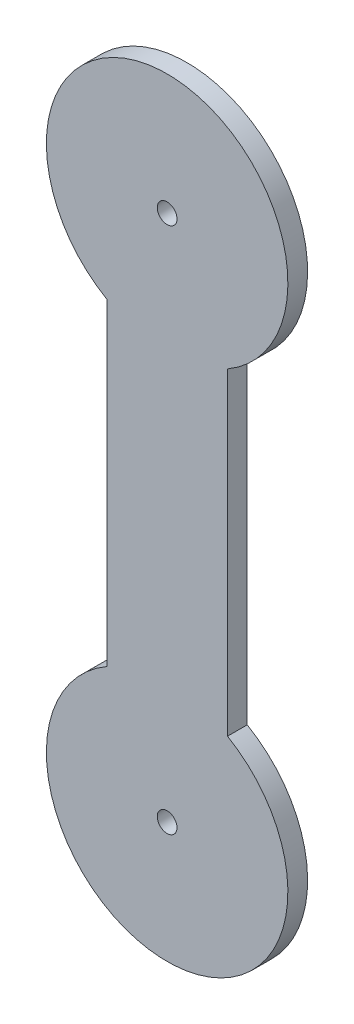
ISO-10303-21;
HEADER;
FILE_DESCRIPTION(('STEP AP214'),'2;1');
FILE_NAME('part.step','',(''),(''),'','','');
FILE_SCHEMA(('AUTOMOTIVE_DESIGN { 1 0 10303 214 1 1 1 1 }'));
ENDSEC;
DATA;
#1=APPLICATION_CONTEXT('core data for automotive mechanical design processes');
#2=APPLICATION_PROTOCOL_DEFINITION('international standard','automotive_design',2000,#1);
#3=PRODUCT_CONTEXT('',#1,'mechanical');
#4=PRODUCT('Part','Part','',(#3));
#5=PRODUCT_RELATED_PRODUCT_CATEGORY('part','',(#4));
#6=PRODUCT_DEFINITION_FORMATION('','',#4);
#7=PRODUCT_DEFINITION_CONTEXT('part definition',#1,'design');
#8=PRODUCT_DEFINITION('design','',#6,#7);
#9=PRODUCT_DEFINITION_SHAPE('','',#8);
#10=(LENGTH_UNIT() NAMED_UNIT(*) SI_UNIT(.MILLI.,.METRE.));
#11=(NAMED_UNIT(*) PLANE_ANGLE_UNIT() SI_UNIT($,.RADIAN.));
#12=(NAMED_UNIT(*) SI_UNIT($,.STERADIAN.) SOLID_ANGLE_UNIT());
#13=UNCERTAINTY_MEASURE_WITH_UNIT(LENGTH_MEASURE(1.E-05),#10,'distance_accuracy_value','');
#14=(GEOMETRIC_REPRESENTATION_CONTEXT(3) GLOBAL_UNCERTAINTY_ASSIGNED_CONTEXT((#13)) GLOBAL_UNIT_ASSIGNED_CONTEXT((#10,
#11,#12)) REPRESENTATION_CONTEXT('',''));
#15=CARTESIAN_POINT('',(0.,0.,0.));
#16=DIRECTION('',(0.,0.,1.));
#17=DIRECTION('',(1.,0.,0.));
#18=AXIS2_PLACEMENT_3D('',#15,#16,#17);
#19=CARTESIAN_POINT('',(19.05,0.,6.223));
#20=DIRECTION('',(0.,0.,-1.));
#21=DIRECTION('',(-1.,0.,0.));
#22=AXIS2_PLACEMENT_3D('',#19,#20,#21);
#23=CYLINDRICAL_SURFACE('',#22,38.1);
#24=CARTESIAN_POINT('',(19.05,0.,0.));
#25=DIRECTION('',(0.,0.,1.));
#26=DIRECTION('',(1.,0.,0.));
#27=AXIS2_PLACEMENT_3D('',#24,#25,#26);
#28=CIRCLE('',#27,38.1);
#29=CARTESIAN_POINT('',(0.,32.9955678841871,0.));
#30=VERTEX_POINT('',#29);
#31=CARTESIAN_POINT('',(38.1,32.9955678841871,0.));
#32=VERTEX_POINT('',#31);
#33=EDGE_CURVE('E103',#30,#32,#28,.T.);
#34=ORIENTED_EDGE('',*,*,#33,.T.);
#35=DIRECTION('',(0.,0.,-1.));
#36=VECTOR('',#35,1.);
#37=CARTESIAN_POINT('',(38.1,32.9955678841871,6.223));
#38=LINE('',#37,#36);
#39=CARTESIAN_POINT('',(38.1,32.9955678841871,6.223));
#40=VERTEX_POINT('',#39);
#41=EDGE_CURVE('E11',#40,#32,#38,.T.);
#42=ORIENTED_EDGE('',*,*,#41,.F.);
#43=CARTESIAN_POINT('',(19.05,0.,6.223));
#44=DIRECTION('',(0.,0.,1.));
#45=DIRECTION('',(1.,0.,0.));
#46=AXIS2_PLACEMENT_3D('',#43,#44,#45);
#47=CIRCLE('',#46,38.1);
#48=CARTESIAN_POINT('',(0.,32.9955678841871,6.223));
#49=VERTEX_POINT('',#48);
#50=EDGE_CURVE('E83',#49,#40,#47,.T.);
#51=ORIENTED_EDGE('',*,*,#50,.F.);
#52=DIRECTION('',(0.,0.,-1.));
#53=VECTOR('',#52,1.);
#54=CARTESIAN_POINT('',(0.,32.9955678841871,6.223));
#55=LINE('',#54,#53);
#56=EDGE_CURVE('E49',#49,#30,#55,.T.);
#57=ORIENTED_EDGE('',*,*,#56,.T.);
#58=EDGE_LOOP('',(#34,#42,#51,#57));
#59=FACE_BOUND('',#58,.T.);
#60=ADVANCED_FACE('F33',(#59),#23,.T.);
#61=CARTESIAN_POINT('',(38.1,-114.721990059437,6.223));
#62=DIRECTION('',(-1.,0.,0.));
#63=DIRECTION('',(0.,0.,1.));
#64=AXIS2_PLACEMENT_3D('',#61,#62,#63);
#65=PLANE('',#64);
#66=DIRECTION('',(0.,1.,0.));
#67=VECTOR('',#66,1.);
#68=CARTESIAN_POINT('',(38.1,-114.721990059437,0.));
#69=LINE('',#68,#67);
#70=CARTESIAN_POINT('',(38.1,133.374432115813,0.));
#71=VERTEX_POINT('',#70);
#72=EDGE_CURVE('E88',#32,#71,#69,.T.);
#73=ORIENTED_EDGE('',*,*,#72,.T.);
#74=DIRECTION('',(0.,0.,-1.));
#75=VECTOR('',#74,1.);
#76=CARTESIAN_POINT('',(38.1,133.374432115813,6.223));
#77=LINE('',#76,#75);
#78=CARTESIAN_POINT('',(38.1,133.374432115813,6.223));
#79=VERTEX_POINT('',#78);
#80=EDGE_CURVE('E41',#79,#71,#77,.T.);
#81=ORIENTED_EDGE('',*,*,#80,.F.);
#82=DIRECTION('',(0.,1.,0.));
#83=VECTOR('',#82,1.);
#84=CARTESIAN_POINT('',(38.1,-114.721990059437,6.223));
#85=LINE('',#84,#83);
#86=EDGE_CURVE('E75',#40,#79,#85,.T.);
#87=ORIENTED_EDGE('',*,*,#86,.F.);
#88=ORIENTED_EDGE('',*,*,#41,.T.);
#89=EDGE_LOOP('',(#73,#81,#87,#88));
#90=FACE_BOUND('',#89,.T.);
#91=ADVANCED_FACE('F87',(#90),#65,.F.);
#92=CARTESIAN_POINT('',(19.05,166.37,6.223));
#93=DIRECTION('',(0.,0.,-1.));
#94=DIRECTION('',(-1.,0.,0.));
#95=AXIS2_PLACEMENT_3D('',#92,#93,#94);
#96=CYLINDRICAL_SURFACE('',#95,38.1);
#97=CARTESIAN_POINT('',(19.05,166.37,0.));
#98=DIRECTION('',(0.,0.,1.));
#99=DIRECTION('',(1.,0.,0.));
#100=AXIS2_PLACEMENT_3D('',#97,#98,#99);
#101=CIRCLE('',#100,38.1);
#102=CARTESIAN_POINT('',(0.,133.374432115813,0.));
#103=VERTEX_POINT('',#102);
#104=EDGE_CURVE('E106',#71,#103,#101,.T.);
#105=ORIENTED_EDGE('',*,*,#104,.T.);
#106=DIRECTION('',(0.,0.,-1.));
#107=VECTOR('',#106,1.);
#108=CARTESIAN_POINT('',(0.,133.374432115813,6.223));
#109=LINE('',#108,#107);
#110=CARTESIAN_POINT('',(0.,133.374432115813,6.223));
#111=VERTEX_POINT('',#110);
#112=EDGE_CURVE('E64',#111,#103,#109,.T.);
#113=ORIENTED_EDGE('',*,*,#112,.F.);
#114=CARTESIAN_POINT('',(19.05,166.37,6.223));
#115=DIRECTION('',(0.,0.,1.));
#116=DIRECTION('',(1.,0.,0.));
#117=AXIS2_PLACEMENT_3D('',#114,#115,#116);
#118=CIRCLE('',#117,38.1);
#119=EDGE_CURVE('E82',#79,#111,#118,.T.);
#120=ORIENTED_EDGE('',*,*,#119,.F.);
#121=ORIENTED_EDGE('',*,*,#80,.T.);
#122=EDGE_LOOP('',(#105,#113,#120,#121));
#123=FACE_BOUND('',#122,.T.);
#124=ADVANCED_FACE('F91',(#123),#96,.T.);
#125=CARTESIAN_POINT('',(19.05,0.,6.223));
#126=DIRECTION('',(0.,0.,-1.));
#127=DIRECTION('',(-1.,0.,0.));
#128=AXIS2_PLACEMENT_3D('',#125,#126,#127);
#129=CYLINDRICAL_SURFACE('',#128,3.1115);
#130=CARTESIAN_POINT('',(19.05,0.,6.223));
#131=DIRECTION('',(0.,0.,1.));
#132=DIRECTION('',(1.,0.,0.));
#133=AXIS2_PLACEMENT_3D('',#130,#131,#132);
#134=CIRCLE('',#133,3.1115);
#135=CARTESIAN_POINT('',(22.1615,0.,6.223));
#136=VERTEX_POINT('',#135);
#137=EDGE_CURVE('E94',#136,#136,#134,.T.);
#138=ORIENTED_EDGE('',*,*,#137,.T.);
#139=EDGE_LOOP('',(#138));
#140=FACE_BOUND('',#139,.T.);
#141=CARTESIAN_POINT('',(19.05,0.,0.));
#142=DIRECTION('',(0.,0.,1.));
#143=DIRECTION('',(1.,0.,0.));
#144=AXIS2_PLACEMENT_3D('',#141,#142,#143);
#145=CIRCLE('',#144,3.1115);
#146=CARTESIAN_POINT('',(22.1615,0.,0.));
#147=VERTEX_POINT('',#146);
#148=EDGE_CURVE('E111',#147,#147,#145,.T.);
#149=ORIENTED_EDGE('',*,*,#148,.F.);
#150=EDGE_LOOP('',(#149));
#151=FACE_BOUND('',#150,.T.);
#152=ADVANCED_FACE('F132',(#140,#151),#129,.F.);
#153=CARTESIAN_POINT('',(0.,-114.721990059437,6.223));
#154=DIRECTION('',(-1.,0.,0.));
#155=DIRECTION('',(0.,0.,1.));
#156=AXIS2_PLACEMENT_3D('',#153,#154,#155);
#157=PLANE('',#156);
#158=DIRECTION('',(0.,1.,0.));
#159=VECTOR('',#158,1.);
#160=CARTESIAN_POINT('',(0.,-114.721990059437,0.));
#161=LINE('',#160,#159);
#162=EDGE_CURVE('E108',#30,#103,#161,.T.);
#163=ORIENTED_EDGE('',*,*,#162,.F.);
#164=ORIENTED_EDGE('',*,*,#56,.F.);
#165=DIRECTION('',(0.,1.,0.));
#166=VECTOR('',#165,1.);
#167=CARTESIAN_POINT('',(0.,-114.721990059437,6.223));
#168=LINE('',#167,#166);
#169=EDGE_CURVE('E92',#49,#111,#168,.T.);
#170=ORIENTED_EDGE('',*,*,#169,.T.);
#171=ORIENTED_EDGE('',*,*,#112,.T.);
#172=EDGE_LOOP('',(#163,#164,#170,#171));
#173=FACE_BOUND('',#172,.T.);
#174=ADVANCED_FACE('F124',(#173),#157,.T.);
#175=CARTESIAN_POINT('',(19.05,166.37,6.223));
#176=DIRECTION('',(0.,0.,-1.));
#177=DIRECTION('',(-1.,0.,0.));
#178=AXIS2_PLACEMENT_3D('',#175,#176,#177);
#179=CYLINDRICAL_SURFACE('',#178,3.1115);
#180=CARTESIAN_POINT('',(19.05,166.37,6.223));
#181=DIRECTION('',(0.,0.,1.));
#182=DIRECTION('',(1.,0.,0.));
#183=AXIS2_PLACEMENT_3D('',#180,#181,#182);
#184=CIRCLE('',#183,3.1115);
#185=CARTESIAN_POINT('',(22.1615,166.37,6.223));
#186=VERTEX_POINT('',#185);
#187=EDGE_CURVE('E100',#186,#186,#184,.T.);
#188=ORIENTED_EDGE('',*,*,#187,.T.);
#189=EDGE_LOOP('',(#188));
#190=FACE_BOUND('',#189,.T.);
#191=CARTESIAN_POINT('',(19.05,166.37,0.));
#192=DIRECTION('',(0.,0.,1.));
#193=DIRECTION('',(1.,0.,0.));
#194=AXIS2_PLACEMENT_3D('',#191,#192,#193);
#195=CIRCLE('',#194,3.1115);
#196=CARTESIAN_POINT('',(22.1615,166.37,0.));
#197=VERTEX_POINT('',#196);
#198=EDGE_CURVE('E114',#197,#197,#195,.T.);
#199=ORIENTED_EDGE('',*,*,#198,.F.);
#200=EDGE_LOOP('',(#199));
#201=FACE_BOUND('',#200,.T.);
#202=ADVANCED_FACE('F122',(#190,#201),#179,.F.);
#203=CARTESIAN_POINT('',(19.05,-114.721990059437,6.223));
#204=DIRECTION('',(0.,0.,1.));
#205=DIRECTION('',(1.,0.,0.));
#206=AXIS2_PLACEMENT_3D('',#203,#204,#205);
#207=PLANE('',#206);
#208=ORIENTED_EDGE('',*,*,#50,.T.);
#209=ORIENTED_EDGE('',*,*,#86,.T.);
#210=ORIENTED_EDGE('',*,*,#119,.T.);
#211=ORIENTED_EDGE('',*,*,#169,.F.);
#212=EDGE_LOOP('',(#208,#209,#210,#211));
#213=FACE_BOUND('',#212,.T.);
#214=ORIENTED_EDGE('',*,*,#137,.F.);
#215=EDGE_LOOP('',(#214));
#216=FACE_BOUND('',#215,.T.);
#217=ORIENTED_EDGE('',*,*,#187,.F.);
#218=EDGE_LOOP('',(#217));
#219=FACE_BOUND('',#218,.T.);
#220=ADVANCED_FACE('F78',(#213,#216,#219),#207,.T.);
#221=CARTESIAN_POINT('',(19.05,-114.721990059437,0.));
#222=DIRECTION('',(0.,0.,1.));
#223=DIRECTION('',(1.,0.,0.));
#224=AXIS2_PLACEMENT_3D('',#221,#222,#223);
#225=PLANE('',#224);
#226=ORIENTED_EDGE('',*,*,#33,.F.);
#227=ORIENTED_EDGE('',*,*,#162,.T.);
#228=ORIENTED_EDGE('',*,*,#104,.F.);
#229=ORIENTED_EDGE('',*,*,#72,.F.);
#230=EDGE_LOOP('',(#226,#227,#228,#229));
#231=FACE_BOUND('',#230,.T.);
#232=ORIENTED_EDGE('',*,*,#148,.T.);
#233=EDGE_LOOP('',(#232));
#234=FACE_BOUND('',#233,.T.);
#235=ORIENTED_EDGE('',*,*,#198,.T.);
#236=EDGE_LOOP('',(#235));
#237=FACE_BOUND('',#236,.T.);
#238=ADVANCED_FACE('F120',(#231,#234,#237),#225,.F.);
#239=CLOSED_SHELL('',(#60,#91,#124,#152,#174,#202,#220,#238));
#240=MANIFOLD_SOLID_BREP('B2',#239);
#241=ADVANCED_BREP_SHAPE_REPRESENTATION('',(#18,#240),#14);
#242=SHAPE_DEFINITION_REPRESENTATION(#9,#241);
ENDSEC;
END-ISO-10303-21;
